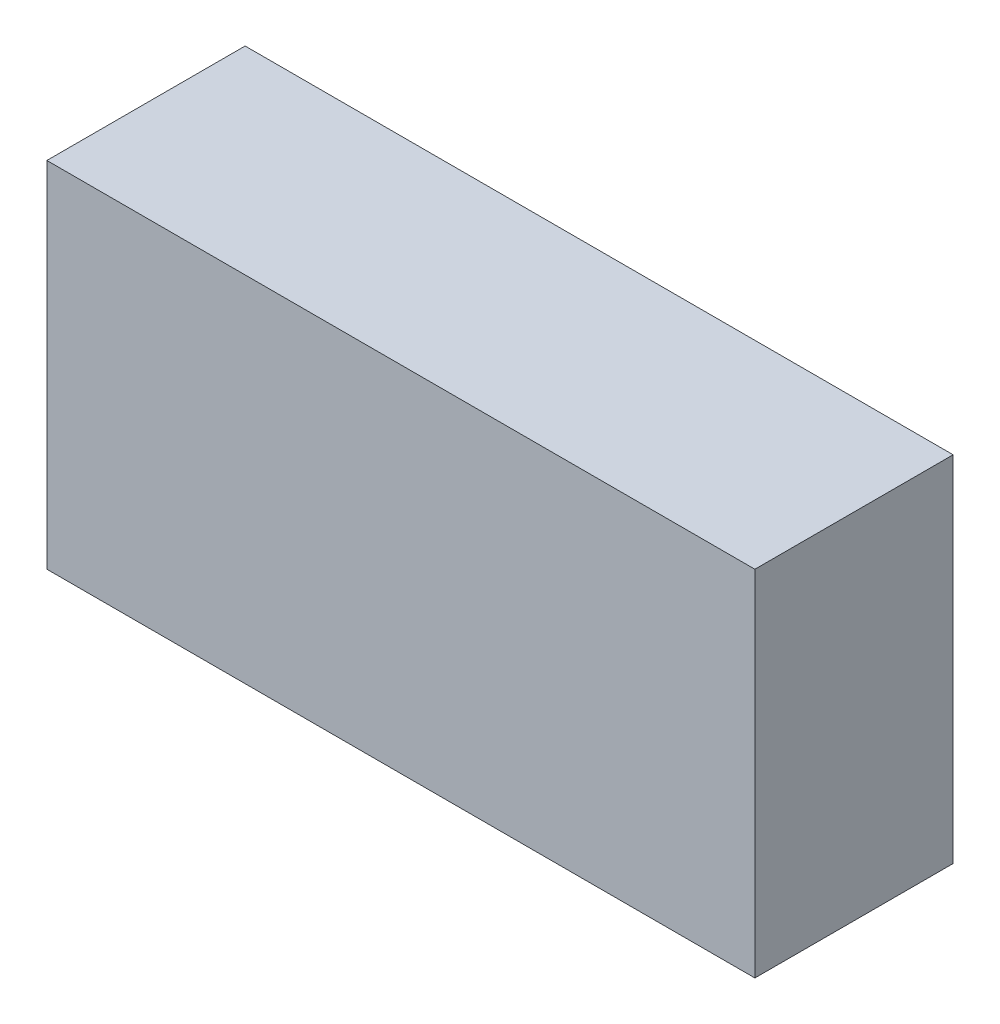
ISO-10303-21;
HEADER;
FILE_DESCRIPTION(('STEP AP214'),'2;1');
FILE_NAME('part.step','',(''),(''),'','','');
FILE_SCHEMA(('AUTOMOTIVE_DESIGN { 1 0 10303 214 1 1 1 1 }'));
ENDSEC;
DATA;
#1=APPLICATION_CONTEXT('core data for automotive mechanical design processes');
#2=APPLICATION_PROTOCOL_DEFINITION('international standard','automotive_design',2000,#1);
#3=PRODUCT_CONTEXT('',#1,'mechanical');
#4=PRODUCT('Part','Part','',(#3));
#5=PRODUCT_RELATED_PRODUCT_CATEGORY('part','',(#4));
#6=PRODUCT_DEFINITION_FORMATION('','',#4);
#7=PRODUCT_DEFINITION_CONTEXT('part definition',#1,'design');
#8=PRODUCT_DEFINITION('design','',#6,#7);
#9=PRODUCT_DEFINITION_SHAPE('','',#8);
#10=(LENGTH_UNIT() NAMED_UNIT(*) SI_UNIT(.MILLI.,.METRE.));
#11=(NAMED_UNIT(*) PLANE_ANGLE_UNIT() SI_UNIT($,.RADIAN.));
#12=(NAMED_UNIT(*) SI_UNIT($,.STERADIAN.) SOLID_ANGLE_UNIT());
#13=UNCERTAINTY_MEASURE_WITH_UNIT(LENGTH_MEASURE(1.E-05),#10,'distance_accuracy_value','');
#14=(GEOMETRIC_REPRESENTATION_CONTEXT(3) GLOBAL_UNCERTAINTY_ASSIGNED_CONTEXT((#13)) GLOBAL_UNIT_ASSIGNED_CONTEXT((#10,
#11,#12)) REPRESENTATION_CONTEXT('',''));
#15=CARTESIAN_POINT('',(0.,0.,0.));
#16=DIRECTION('',(0.,0.,1.));
#17=DIRECTION('',(1.,0.,0.));
#18=AXIS2_PLACEMENT_3D('',#15,#16,#17);
#19=CARTESIAN_POINT('',(-1.25718,-1.18082,0.762));
#20=DIRECTION('',(0.,0.,1.));
#21=DIRECTION('',(1.,0.,0.));
#22=AXIS2_PLACEMENT_3D('',#19,#20,#21);
#23=PLANE('',#22);
#24=DIRECTION('',(0.,1.,0.));
#25=VECTOR('',#24,1.);
#26=CARTESIAN_POINT('',(1.28282,-1.18082,0.762));
#27=LINE('',#26,#25);
#28=CARTESIAN_POINT('',(1.28282,0.0891799999999999,0.762));
#29=VERTEX_POINT('',#28);
#30=CARTESIAN_POINT('',(1.28282,-1.18082,0.762));
#31=VERTEX_POINT('',#30);
#32=EDGE_CURVE('E76',#29,#31,#27,.F.);
#33=ORIENTED_EDGE('',*,*,#32,.F.);
#34=DIRECTION('',(1.,0.,0.));
#35=VECTOR('',#34,1.);
#36=CARTESIAN_POINT('',(-1.25718,0.08918,0.762));
#37=LINE('',#36,#35);
#38=CARTESIAN_POINT('',(-1.25718,0.0891799999999999,0.762));
#39=VERTEX_POINT('',#38);
#40=EDGE_CURVE('E58',#39,#29,#37,.T.);
#41=ORIENTED_EDGE('',*,*,#40,.F.);
#42=DIRECTION('',(0.,1.,0.));
#43=VECTOR('',#42,1.);
#44=CARTESIAN_POINT('',(-1.25718,-1.18082,0.762));
#45=LINE('',#44,#43);
#46=CARTESIAN_POINT('',(-1.25718,-1.18082,0.762));
#47=VERTEX_POINT('',#46);
#48=EDGE_CURVE('E20',#39,#47,#45,.F.);
#49=ORIENTED_EDGE('',*,*,#48,.T.);
#50=DIRECTION('',(1.,0.,0.));
#51=VECTOR('',#50,1.);
#52=CARTESIAN_POINT('',(-1.25718,-1.18082,0.762));
#53=LINE('',#52,#51);
#54=EDGE_CURVE('E55',#47,#31,#53,.T.);
#55=ORIENTED_EDGE('',*,*,#54,.T.);
#56=EDGE_LOOP('',(#33,#41,#49,#55));
#57=FACE_BOUND('',#56,.T.);
#58=ADVANCED_FACE('F17',(#57),#23,.T.);
#59=CARTESIAN_POINT('',(-1.25718,-1.18082,0.0508));
#60=DIRECTION('',(1.,0.,0.));
#61=DIRECTION('',(0.,0.,-1.));
#62=AXIS2_PLACEMENT_3D('',#59,#60,#61);
#63=PLANE('',#62);
#64=DIRECTION('',(0.,0.,1.));
#65=VECTOR('',#64,1.);
#66=CARTESIAN_POINT('',(-1.25718,0.08918,0.0508));
#67=LINE('',#66,#65);
#68=CARTESIAN_POINT('',(-1.25718,0.0891799999999999,0.0508));
#69=VERTEX_POINT('',#68);
#70=EDGE_CURVE('E78',#69,#39,#67,.T.);
#71=ORIENTED_EDGE('',*,*,#70,.F.);
#72=DIRECTION('',(0.,1.,0.));
#73=VECTOR('',#72,1.);
#74=CARTESIAN_POINT('',(-1.25718,-1.18082,0.0508));
#75=LINE('',#74,#73);
#76=CARTESIAN_POINT('',(-1.25718,-1.18082,0.0508));
#77=VERTEX_POINT('',#76);
#78=EDGE_CURVE('E73',#69,#77,#75,.F.);
#79=ORIENTED_EDGE('',*,*,#78,.T.);
#80=DIRECTION('',(0.,0.,1.));
#81=VECTOR('',#80,1.);
#82=CARTESIAN_POINT('',(-1.25718,-1.18082,0.0508));
#83=LINE('',#82,#81);
#84=EDGE_CURVE('E63',#77,#47,#83,.T.);
#85=ORIENTED_EDGE('',*,*,#84,.T.);
#86=ORIENTED_EDGE('',*,*,#48,.F.);
#87=EDGE_LOOP('',(#71,#79,#85,#86));
#88=FACE_BOUND('',#87,.T.);
#89=ADVANCED_FACE('F72',(#88),#63,.F.);
#90=CARTESIAN_POINT('',(-1.25718,-1.18082,0.0508));
#91=DIRECTION('',(0.,1.,0.));
#92=DIRECTION('',(0.,0.,1.));
#93=AXIS2_PLACEMENT_3D('',#90,#91,#92);
#94=PLANE('',#93);
#95=ORIENTED_EDGE('',*,*,#54,.F.);
#96=ORIENTED_EDGE('',*,*,#84,.F.);
#97=DIRECTION('',(1.,0.,0.));
#98=VECTOR('',#97,1.);
#99=CARTESIAN_POINT('',(-1.25718,-1.18082,0.0508));
#100=LINE('',#99,#98);
#101=CARTESIAN_POINT('',(1.28282,-1.18082,0.0508));
#102=VERTEX_POINT('',#101);
#103=EDGE_CURVE('E83',#77,#102,#100,.T.);
#104=ORIENTED_EDGE('',*,*,#103,.T.);
#105=DIRECTION('',(0.,0.,-1.));
#106=VECTOR('',#105,1.);
#107=CARTESIAN_POINT('',(1.28282,-1.18082,0.0508));
#108=LINE('',#107,#106);
#109=EDGE_CURVE('E69',#31,#102,#108,.T.);
#110=ORIENTED_EDGE('',*,*,#109,.F.);
#111=EDGE_LOOP('',(#95,#96,#104,#110));
#112=FACE_BOUND('',#111,.T.);
#113=ADVANCED_FACE('F66',(#112),#94,.F.);
#114=CARTESIAN_POINT('',(1.28282,-1.18082,0.0508));
#115=DIRECTION('',(1.,0.,0.));
#116=DIRECTION('',(0.,0.,-1.));
#117=AXIS2_PLACEMENT_3D('',#114,#115,#116);
#118=PLANE('',#117);
#119=DIRECTION('',(0.,0.,1.));
#120=VECTOR('',#119,1.);
#121=CARTESIAN_POINT('',(1.28282,0.08918,0.0508));
#122=LINE('',#121,#120);
#123=CARTESIAN_POINT('',(1.28282,0.0891799999999999,0.0508));
#124=VERTEX_POINT('',#123);
#125=EDGE_CURVE('E34',#29,#124,#122,.F.);
#126=ORIENTED_EDGE('',*,*,#125,.F.);
#127=ORIENTED_EDGE('',*,*,#32,.T.);
#128=ORIENTED_EDGE('',*,*,#109,.T.);
#129=DIRECTION('',(0.,1.,0.));
#130=VECTOR('',#129,1.);
#131=CARTESIAN_POINT('',(1.28282,-1.18082,0.0508));
#132=LINE('',#131,#130);
#133=EDGE_CURVE('E26',#102,#124,#132,.T.);
#134=ORIENTED_EDGE('',*,*,#133,.T.);
#135=EDGE_LOOP('',(#126,#127,#128,#134));
#136=FACE_BOUND('',#135,.T.);
#137=ADVANCED_FACE('F88',(#136),#118,.T.);
#138=CARTESIAN_POINT('',(-1.25718,0.08918,0.0508));
#139=DIRECTION('',(0.,1.,0.));
#140=DIRECTION('',(0.,0.,1.));
#141=AXIS2_PLACEMENT_3D('',#138,#139,#140);
#142=PLANE('',#141);
#143=ORIENTED_EDGE('',*,*,#40,.T.);
#144=ORIENTED_EDGE('',*,*,#125,.T.);
#145=DIRECTION('',(1.,0.,0.));
#146=VECTOR('',#145,1.);
#147=CARTESIAN_POINT('',(-1.25718,0.0891799999999999,0.0508));
#148=LINE('',#147,#146);
#149=EDGE_CURVE('E11',#124,#69,#148,.F.);
#150=ORIENTED_EDGE('',*,*,#149,.T.);
#151=ORIENTED_EDGE('',*,*,#70,.T.);
#152=EDGE_LOOP('',(#143,#144,#150,#151));
#153=FACE_BOUND('',#152,.T.);
#154=ADVANCED_FACE('F91',(#153),#142,.T.);
#155=CARTESIAN_POINT('',(-1.25718,-1.18082,0.0508));
#156=DIRECTION('',(0.,0.,1.));
#157=DIRECTION('',(1.,0.,0.));
#158=AXIS2_PLACEMENT_3D('',#155,#156,#157);
#159=PLANE('',#158);
#160=ORIENTED_EDGE('',*,*,#133,.F.);
#161=ORIENTED_EDGE('',*,*,#103,.F.);
#162=ORIENTED_EDGE('',*,*,#78,.F.);
#163=ORIENTED_EDGE('',*,*,#149,.F.);
#164=EDGE_LOOP('',(#160,#161,#162,#163));
#165=FACE_BOUND('',#164,.T.);
#166=ADVANCED_FACE('F90',(#165),#159,.F.);
#167=CLOSED_SHELL('',(#58,#89,#113,#137,#154,#166));
#168=MANIFOLD_SOLID_BREP('B1',#167);
#169=ADVANCED_BREP_SHAPE_REPRESENTATION('',(#18,#168),#14);
#170=SHAPE_DEFINITION_REPRESENTATION(#9,#169);
ENDSEC;
END-ISO-10303-21;
